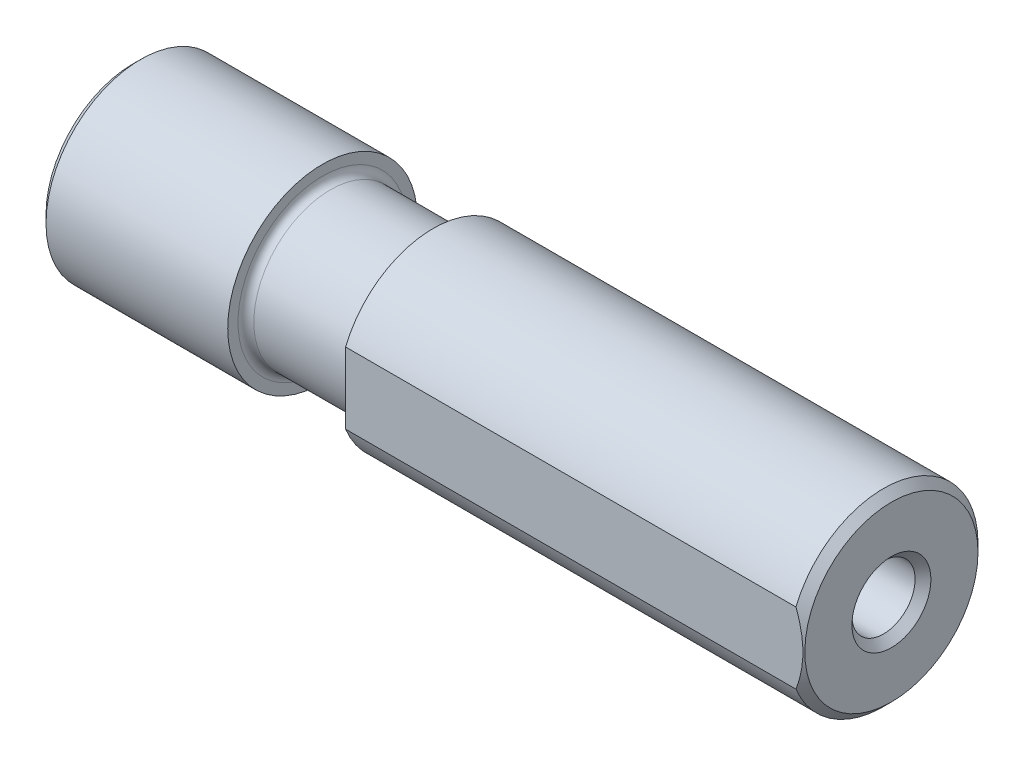
ISO-10303-21;
HEADER;
FILE_DESCRIPTION(('STEP AP214'),'2;1');
FILE_NAME('part.step','',(''),(''),'','','');
FILE_SCHEMA(('AUTOMOTIVE_DESIGN { 1 0 10303 214 1 1 1 1 }'));
ENDSEC;
DATA;
#1=APPLICATION_CONTEXT('core data for automotive mechanical design processes');
#2=APPLICATION_PROTOCOL_DEFINITION('international standard','automotive_design',2000,#1);
#3=PRODUCT_CONTEXT('',#1,'mechanical');
#4=PRODUCT('Part','Part','',(#3));
#5=PRODUCT_RELATED_PRODUCT_CATEGORY('part','',(#4));
#6=PRODUCT_DEFINITION_FORMATION('','',#4);
#7=PRODUCT_DEFINITION_CONTEXT('part definition',#1,'design');
#8=PRODUCT_DEFINITION('design','',#6,#7);
#9=PRODUCT_DEFINITION_SHAPE('','',#8);
#10=(LENGTH_UNIT() NAMED_UNIT(*) SI_UNIT(.MILLI.,.METRE.));
#11=(NAMED_UNIT(*) PLANE_ANGLE_UNIT() SI_UNIT($,.RADIAN.));
#12=(NAMED_UNIT(*) SI_UNIT($,.STERADIAN.) SOLID_ANGLE_UNIT());
#13=UNCERTAINTY_MEASURE_WITH_UNIT(LENGTH_MEASURE(1.E-05),#10,'distance_accuracy_value','');
#14=(GEOMETRIC_REPRESENTATION_CONTEXT(3) GLOBAL_UNCERTAINTY_ASSIGNED_CONTEXT((#13)) GLOBAL_UNIT_ASSIGNED_CONTEXT((#10,
#11,#12)) REPRESENTATION_CONTEXT('',''));
#15=CARTESIAN_POINT('',(0.,0.,0.));
#16=DIRECTION('',(0.,0.,1.));
#17=DIRECTION('',(1.,0.,0.));
#18=AXIS2_PLACEMENT_3D('',#15,#16,#17);
#19=CARTESIAN_POINT('',(0.,0.,0.));
#20=DIRECTION('',(-1.,0.,0.));
#21=DIRECTION('',(0.,0.,1.));
#22=AXIS2_PLACEMENT_3D('',#19,#20,#21);
#23=PLANE('',#22);
#24=CARTESIAN_POINT('',(0.,0.,0.));
#25=DIRECTION('',(-1.,0.,0.));
#26=DIRECTION('',(0.,0.,1.));
#27=AXIS2_PLACEMENT_3D('',#24,#25,#26);
#28=CIRCLE('',#27,1.25);
#29=CARTESIAN_POINT('',(0.,0.,1.25));
#30=VERTEX_POINT('',#29);
#31=EDGE_CURVE('E249',#30,#30,#28,.F.);
#32=ORIENTED_EDGE('',*,*,#31,.T.);
#33=EDGE_LOOP('',(#32));
#34=FACE_BOUND('',#33,.T.);
#35=CARTESIAN_POINT('',(0.,0.,0.));
#36=DIRECTION('',(-1.,0.,0.));
#37=DIRECTION('',(0.,0.,1.));
#38=AXIS2_PLACEMENT_3D('',#35,#36,#37);
#39=CIRCLE('',#38,2.75);
#40=CARTESIAN_POINT('',(0.,0.,2.75));
#41=VERTEX_POINT('',#40);
#42=EDGE_CURVE('E246',#41,#41,#39,.T.);
#43=ORIENTED_EDGE('',*,*,#42,.T.);
#44=EDGE_LOOP('',(#43));
#45=FACE_BOUND('',#44,.T.);
#46=ADVANCED_FACE('F17',(#34,#45),#23,.T.);
#47=CARTESIAN_POINT('',(24.,0.,0.));
#48=DIRECTION('',(1.,0.,0.));
#49=DIRECTION('',(0.,0.,-1.));
#50=AXIS2_PLACEMENT_3D('',#47,#48,#49);
#51=CYLINDRICAL_SURFACE('',#50,3.);
#52=CARTESIAN_POINT('',(0.250000000000004,0.,0.));
#53=DIRECTION('',(-1.,0.,0.));
#54=DIRECTION('',(0.,0.,1.));
#55=AXIS2_PLACEMENT_3D('',#52,#53,#54);
#56=CIRCLE('',#55,3.);
#57=CARTESIAN_POINT('',(0.250000000000004,0.,3.));
#58=VERTEX_POINT('',#57);
#59=EDGE_CURVE('E261',#58,#58,#56,.F.);
#60=ORIENTED_EDGE('',*,*,#59,.T.);
#61=EDGE_LOOP('',(#60));
#62=FACE_BOUND('',#61,.T.);
#63=CARTESIAN_POINT('',(6.,0.,0.));
#64=DIRECTION('',(1.,0.,0.));
#65=DIRECTION('',(0.,0.,-1.));
#66=AXIS2_PLACEMENT_3D('',#63,#64,#65);
#67=CIRCLE('',#66,3.);
#68=CARTESIAN_POINT('',(6.,0.,-3.));
#69=VERTEX_POINT('',#68);
#70=EDGE_CURVE('E244',#69,#69,#67,.T.);
#71=ORIENTED_EDGE('',*,*,#70,.F.);
#72=EDGE_LOOP('',(#71));
#73=FACE_BOUND('',#72,.T.);
#74=ADVANCED_FACE('F95',(#62,#73),#51,.T.);
#75=CARTESIAN_POINT('',(6.,3.,0.));
#76=DIRECTION('',(1.,0.,0.));
#77=DIRECTION('',(0.,0.,-1.));
#78=AXIS2_PLACEMENT_3D('',#75,#76,#77);
#79=PLANE('',#78);
#80=CARTESIAN_POINT('',(6.,0.,0.));
#81=DIRECTION('',(1.,0.,0.));
#82=DIRECTION('',(0.,0.,-1.));
#83=AXIS2_PLACEMENT_3D('',#80,#81,#82);
#84=CIRCLE('',#83,2.675);
#85=CARTESIAN_POINT('',(6.,0.,-2.675));
#86=VERTEX_POINT('',#85);
#87=EDGE_CURVE('E11',#86,#86,#84,.F.);
#88=ORIENTED_EDGE('',*,*,#87,.T.);
#89=EDGE_LOOP('',(#88));
#90=FACE_BOUND('',#89,.T.);
#91=ORIENTED_EDGE('',*,*,#70,.T.);
#92=EDGE_LOOP('',(#91));
#93=FACE_BOUND('',#92,.T.);
#94=ADVANCED_FACE('F92',(#90,#93),#79,.T.);
#95=CARTESIAN_POINT('',(24.,0.,0.));
#96=DIRECTION('',(1.,0.,0.));
#97=DIRECTION('',(0.,0.,-1.));
#98=AXIS2_PLACEMENT_3D('',#95,#96,#97);
#99=CYLINDRICAL_SURFACE('',#98,2.425);
#100=CARTESIAN_POINT('',(9.25,0.,0.));
#101=DIRECTION('',(-1.,0.,0.));
#102=DIRECTION('',(0.,0.,1.));
#103=AXIS2_PLACEMENT_3D('',#100,#101,#102);
#104=CIRCLE('',#103,2.425);
#105=CARTESIAN_POINT('',(9.25,0.,2.425));
#106=VERTEX_POINT('',#105);
#107=EDGE_CURVE('E25',#106,#106,#104,.T.);
#108=ORIENTED_EDGE('',*,*,#107,.T.);
#109=EDGE_LOOP('',(#108));
#110=FACE_BOUND('',#109,.T.);
#111=CARTESIAN_POINT('',(6.25,0.,0.));
#112=DIRECTION('',(1.,0.,0.));
#113=DIRECTION('',(0.,0.,-1.));
#114=AXIS2_PLACEMENT_3D('',#111,#112,#113);
#115=CIRCLE('',#114,2.425);
#116=CARTESIAN_POINT('',(6.25,0.,-2.425));
#117=VERTEX_POINT('',#116);
#118=EDGE_CURVE('E62',#117,#117,#115,.T.);
#119=ORIENTED_EDGE('',*,*,#118,.T.);
#120=EDGE_LOOP('',(#119));
#121=FACE_BOUND('',#120,.T.);
#122=ADVANCED_FACE('F73',(#110,#121),#99,.T.);
#123=CARTESIAN_POINT('',(9.5,2.425,0.));
#124=DIRECTION('',(-1.,0.,0.));
#125=DIRECTION('',(0.,0.,1.));
#126=AXIS2_PLACEMENT_3D('',#123,#124,#125);
#127=PLANE('',#126);
#128=DIRECTION('',(0.,1.,0.));
#129=VECTOR('',#128,1.);
#130=CARTESIAN_POINT('',(9.5,3.45940288963377,2.77));
#131=LINE('',#130,#129);
#132=CARTESIAN_POINT('',(9.5,-1.12569978235763,2.77));
#133=VERTEX_POINT('',#132);
#134=CARTESIAN_POINT('',(9.5,1.12569978235763,2.77));
#135=VERTEX_POINT('',#134);
#136=EDGE_CURVE('E37',#133,#135,#131,.T.);
#137=ORIENTED_EDGE('',*,*,#136,.T.);
#138=CARTESIAN_POINT('',(9.5,0.,0.));
#139=DIRECTION('',(1.,0.,0.));
#140=DIRECTION('',(0.,0.,-1.));
#141=AXIS2_PLACEMENT_3D('',#138,#139,#140);
#142=CIRCLE('',#141,2.99);
#143=EDGE_CURVE('E54',#133,#135,#142,.T.);
#144=ORIENTED_EDGE('',*,*,#143,.F.);
#145=EDGE_LOOP('',(#137,#144));
#146=FACE_BOUND('',#145,.T.);
#147=CARTESIAN_POINT('',(9.5,0.,0.));
#148=DIRECTION('',(-1.,0.,0.));
#149=DIRECTION('',(0.,0.,1.));
#150=AXIS2_PLACEMENT_3D('',#147,#148,#149);
#151=CIRCLE('',#150,2.675);
#152=CARTESIAN_POINT('',(9.5,0.,2.675));
#153=VERTEX_POINT('',#152);
#154=EDGE_CURVE('E58',#153,#153,#151,.F.);
#155=ORIENTED_EDGE('',*,*,#154,.T.);
#156=EDGE_LOOP('',(#155));
#157=FACE_BOUND('',#156,.T.);
#158=ADVANCED_FACE('F81',(#146,#157),#127,.T.);
#159=CARTESIAN_POINT('',(24.,0.,0.));
#160=DIRECTION('',(1.,0.,0.));
#161=DIRECTION('',(0.,0.,-1.));
#162=AXIS2_PLACEMENT_3D('',#159,#160,#161);
#163=CYLINDRICAL_SURFACE('',#162,2.99);
#164=DIRECTION('',(1.,0.,0.));
#165=VECTOR('',#164,1.);
#166=CARTESIAN_POINT('',(24.,1.12569978235763,2.77));
#167=LINE('',#166,#165);
#168=CARTESIAN_POINT('',(23.75,1.12569978235762,2.77));
#169=VERTEX_POINT('',#168);
#170=EDGE_CURVE('E44',#135,#169,#167,.T.);
#171=ORIENTED_EDGE('',*,*,#170,.T.);
#172=CARTESIAN_POINT('',(23.75,0.,0.));
#173=DIRECTION('',(1.,0.,0.));
#174=DIRECTION('',(0.,0.,-1.));
#175=AXIS2_PLACEMENT_3D('',#172,#173,#174);
#176=CIRCLE('',#175,2.99);
#177=CARTESIAN_POINT('',(23.75,-1.12569978235763,2.77));
#178=VERTEX_POINT('',#177);
#179=EDGE_CURVE('E52',#169,#178,#176,.F.);
#180=ORIENTED_EDGE('',*,*,#179,.T.);
#181=DIRECTION('',(1.,0.,0.));
#182=VECTOR('',#181,1.);
#183=CARTESIAN_POINT('',(24.,-1.12569978235763,2.77));
#184=LINE('',#183,#182);
#185=EDGE_CURVE('E32',#178,#133,#184,.F.);
#186=ORIENTED_EDGE('',*,*,#185,.T.);
#187=ORIENTED_EDGE('',*,*,#143,.T.);
#188=EDGE_LOOP('',(#171,#180,#186,#187));
#189=FACE_BOUND('',#188,.T.);
#190=ADVANCED_FACE('F51',(#189),#163,.T.);
#191=CARTESIAN_POINT('',(24.,2.99,0.));
#192=DIRECTION('',(1.,0.,0.));
#193=DIRECTION('',(0.,0.,-1.));
#194=AXIS2_PLACEMENT_3D('',#191,#192,#193);
#195=PLANE('',#194);
#196=CARTESIAN_POINT('',(24.,0.,0.));
#197=DIRECTION('',(1.,0.,0.));
#198=DIRECTION('',(0.,0.,-1.));
#199=AXIS2_PLACEMENT_3D('',#196,#197,#198);
#200=CIRCLE('',#199,1.25);
#201=CARTESIAN_POINT('',(24.,0.,-1.25));
#202=VERTEX_POINT('',#201);
#203=EDGE_CURVE('E59',#202,#202,#200,.F.);
#204=ORIENTED_EDGE('',*,*,#203,.T.);
#205=EDGE_LOOP('',(#204));
#206=FACE_BOUND('',#205,.T.);
#207=CARTESIAN_POINT('',(24.,0.,0.));
#208=DIRECTION('',(1.,0.,0.));
#209=DIRECTION('',(0.,0.,-1.));
#210=AXIS2_PLACEMENT_3D('',#207,#208,#209);
#211=CIRCLE('',#210,2.74);
#212=CARTESIAN_POINT('',(24.,0.,-2.74));
#213=VERTEX_POINT('',#212);
#214=EDGE_CURVE('E65',#213,#213,#211,.T.);
#215=ORIENTED_EDGE('',*,*,#214,.T.);
#216=EDGE_LOOP('',(#215));
#217=FACE_BOUND('',#216,.T.);
#218=ADVANCED_FACE('F90',(#206,#217),#195,.T.);
#219=CARTESIAN_POINT('',(0.,0.,0.));
#220=DIRECTION('',(1.,0.,0.));
#221=DIRECTION('',(0.,0.,-1.));
#222=AXIS2_PLACEMENT_3D('',#219,#220,#221);
#223=CYLINDRICAL_SURFACE('',#222,1.);
#224=CARTESIAN_POINT('',(0.25,0.,0.));
#225=DIRECTION('',(-1.,0.,0.));
#226=DIRECTION('',(0.,0.,1.));
#227=AXIS2_PLACEMENT_3D('',#224,#225,#226);
#228=CIRCLE('',#227,1.);
#229=CARTESIAN_POINT('',(0.25,0.,1.));
#230=VERTEX_POINT('',#229);
#231=EDGE_CURVE('E258',#230,#230,#228,.T.);
#232=ORIENTED_EDGE('',*,*,#231,.T.);
#233=EDGE_LOOP('',(#232));
#234=FACE_BOUND('',#233,.T.);
#235=CARTESIAN_POINT('',(23.75,0.,0.));
#236=DIRECTION('',(1.,0.,0.));
#237=DIRECTION('',(0.,0.,-1.));
#238=AXIS2_PLACEMENT_3D('',#235,#236,#237);
#239=CIRCLE('',#238,1.);
#240=CARTESIAN_POINT('',(23.75,0.,-1.));
#241=VERTEX_POINT('',#240);
#242=EDGE_CURVE('E255',#241,#241,#239,.T.);
#243=ORIENTED_EDGE('',*,*,#242,.T.);
#244=EDGE_LOOP('',(#243));
#245=FACE_BOUND('',#244,.T.);
#246=ADVANCED_FACE('F116',(#234,#245),#223,.F.);
#247=CARTESIAN_POINT('',(0.,0.,0.));
#248=DIRECTION('',(-1.,0.,0.));
#249=DIRECTION('',(0.,0.,1.));
#250=AXIS2_PLACEMENT_3D('',#247,#248,#249);
#251=CONICAL_SURFACE('',#250,1.25,0.785398163397448);
#252=ORIENTED_EDGE('',*,*,#231,.F.);
#253=EDGE_LOOP('',(#252));
#254=FACE_BOUND('',#253,.T.);
#255=ORIENTED_EDGE('',*,*,#31,.F.);
#256=EDGE_LOOP('',(#255));
#257=FACE_BOUND('',#256,.T.);
#258=ADVANCED_FACE('F108',(#254,#257),#251,.F.);
#259=CARTESIAN_POINT('',(0.250000000000004,0.,0.));
#260=DIRECTION('',(1.,0.,0.));
#261=DIRECTION('',(0.,0.,-1.));
#262=AXIS2_PLACEMENT_3D('',#259,#260,#261);
#263=CONICAL_SURFACE('',#262,3.,0.78539816339745);
#264=ORIENTED_EDGE('',*,*,#42,.F.);
#265=EDGE_LOOP('',(#264));
#266=FACE_BOUND('',#265,.T.);
#267=ORIENTED_EDGE('',*,*,#59,.F.);
#268=EDGE_LOOP('',(#267));
#269=FACE_BOUND('',#268,.T.);
#270=ADVANCED_FACE('F115',(#266,#269),#263,.T.);
#271=CARTESIAN_POINT('',(23.75,0.,0.));
#272=DIRECTION('',(1.,0.,0.));
#273=DIRECTION('',(0.,0.,-1.));
#274=AXIS2_PLACEMENT_3D('',#271,#272,#273);
#275=CONICAL_SURFACE('',#274,1.,0.78539816339745);
#276=ORIENTED_EDGE('',*,*,#203,.F.);
#277=EDGE_LOOP('',(#276));
#278=FACE_BOUND('',#277,.T.);
#279=ORIENTED_EDGE('',*,*,#242,.F.);
#280=EDGE_LOOP('',(#279));
#281=FACE_BOUND('',#280,.T.);
#282=ADVANCED_FACE('F123',(#278,#281),#275,.F.);
#283=CARTESIAN_POINT('',(24.,0.,0.));
#284=DIRECTION('',(-1.,0.,0.));
#285=DIRECTION('',(0.,0.,1.));
#286=AXIS2_PLACEMENT_3D('',#283,#284,#285);
#287=CONICAL_SURFACE('',#286,2.74,0.785398163397448);
#288=CARTESIAN_POINT('',(17.764576528817,8.5372903480591,2.77));
#289=CARTESIAN_POINT('',(17.9048423774126,8.38982279413043,2.77));
#290=CARTESIAN_POINT('',(18.0449300391954,8.24218561423592,2.77));
#291=CARTESIAN_POINT('',(18.3246811093057,7.94650817648765,2.77));
#292=CARTESIAN_POINT('',(18.464344514996,7.79846791613926,2.77));
#293=CARTESIAN_POINT('',(18.8827116745884,7.35352428546614,2.77));
#294=CARTESIAN_POINT('',(19.1606737813262,7.0559225152558,2.77));
#295=CARTESIAN_POINT('',(19.7171983228802,6.4544639822048,2.77));
#296=CARTESIAN_POINT('',(19.9957263400019,6.15057526461015,2.77));
#297=CARTESIAN_POINT('',(20.4102363084596,5.6918583543068,2.77));
#298=CARTESIAN_POINT('',(20.5478385042845,5.53849574291661,2.77));
#299=CARTESIAN_POINT('',(20.8216699488644,5.2305527529665,2.77));
#300=CARTESIAN_POINT('',(20.9578992082289,5.0759723838335,2.77));
#301=CARTESIAN_POINT('',(21.3016993141576,4.68146609576847,2.77));
#302=CARTESIAN_POINT('',(21.5080925456076,4.44050511918899,2.77));
#303=CARTESIAN_POINT('',(21.8130863908197,4.07504906950316,2.77));
#304=CARTESIAN_POINT('',(21.914027234003,3.95250796673908,2.77));
#305=CARTESIAN_POINT('',(22.1139131489713,3.70580979912626,2.77));
#306=CARTESIAN_POINT('',(22.2128582772866,3.58165278021408,2.77));
#307=CARTESIAN_POINT('',(22.4079774597422,3.33160921837402,2.77));
#308=CARTESIAN_POINT('',(22.5041570872622,3.20572703843905,2.77));
#309=CARTESIAN_POINT('',(22.693187216828,2.95144645110269,2.77));
#310=CARTESIAN_POINT('',(22.7860372387731,2.82304768492615,2.77));
#311=CARTESIAN_POINT('',(22.9671171892356,2.56328153721349,2.77));
#312=CARTESIAN_POINT('',(23.0553533936085,2.43191855554756,2.77));
#313=CARTESIAN_POINT('',(23.2256439160106,2.16525881078545,2.77));
#314=CARTESIAN_POINT('',(23.3077004347633,2.029963472106,2.77));
#315=CARTESIAN_POINT('',(23.4430410393034,1.79001020101257,2.77));
#316=CARTESIAN_POINT('',(23.4982830234326,1.68646336682811,2.77));
#317=CARTESIAN_POINT('',(23.6025268125139,1.47620436093873,2.77));
#318=CARTESIAN_POINT('',(23.651527115105,1.36949143475335,2.77));
#319=CARTESIAN_POINT('',(23.7411481130313,1.15319030709812,2.77));
#320=CARTESIAN_POINT('',(23.7818100925112,1.04361945598801,2.77));
#321=CARTESIAN_POINT('',(23.8527564505579,0.821184117433054,2.77));
#322=CARTESIAN_POINT('',(23.8830499459437,0.708322618659198,2.77));
#323=CARTESIAN_POINT('',(23.9241026783283,0.512583213206293,2.77));
#324=CARTESIAN_POINT('',(23.9379705317478,0.430357010480408,2.77));
#325=CARTESIAN_POINT('',(23.9585593997502,0.26501196302226,2.77));
#326=CARTESIAN_POINT('',(23.9652817755554,0.181893291355009,2.77));
#327=CARTESIAN_POINT('',(23.9712036659773,0.015473577781737,2.77));
#328=CARTESIAN_POINT('',(23.9704112393818,-0.0678271730084054,2.77));
#329=CARTESIAN_POINT('',(23.9613714741798,-0.234025538375774,2.77));
#330=CARTESIAN_POINT('',(23.9531230129271,-0.316923090354021,2.77));
#331=CARTESIAN_POINT('',(23.9268598674314,-0.50097188338168,2.77));
#332=CARTESIAN_POINT('',(23.9070133596741,-0.601861668876813,2.77));
#333=CARTESIAN_POINT('',(23.8580353416469,-0.801373300254173,2.77));
#334=CARTESIAN_POINT('',(23.8288980111403,-0.899993682835503,2.77));
#335=CARTESIAN_POINT('',(23.762797688243,-1.09513234595655,2.77));
#336=CARTESIAN_POINT('',(23.7257932546571,-1.19163638576721,2.77));
#337=CARTESIAN_POINT('',(23.6455974035726,-1.38198132191513,2.77));
#338=CARTESIAN_POINT('',(23.602407125151,-1.47582270475743,2.77));
#339=CARTESIAN_POINT('',(23.4833499362874,-1.7174817074,2.77));
#340=CARTESIAN_POINT('',(23.4035983756312,-1.86337605685073,2.77));
#341=CARTESIAN_POINT('',(23.2353859801521,-2.15008816324019,2.77));
#342=CARTESIAN_POINT('',(23.1469186913962,-2.29090205111037,2.77));
#343=CARTESIAN_POINT('',(22.963642719388,-2.56883303680629,2.77));
#344=CARTESIAN_POINT('',(22.8688182224558,-2.70593962820393,2.77));
#345=CARTESIAN_POINT('',(22.6747761932785,-2.97692352410337,2.77));
#346=CARTESIAN_POINT('',(22.5755599528576,-3.11080176055531,2.77));
#347=CARTESIAN_POINT('',(22.3730744772916,-3.37707915711643,2.77));
#348=CARTESIAN_POINT('',(22.2697798956143,-3.50945896122559,2.77));
#349=CARTESIAN_POINT('',(22.0606646889163,-3.77221421878945,2.77));
#350=CARTESIAN_POINT('',(21.9548439127792,-3.90258955156637,2.77));
#351=CARTESIAN_POINT('',(21.7414167269421,-4.16152576847423,2.77));
#352=CARTESIAN_POINT('',(21.6338133553397,-4.29008916252522,2.77));
#353=CARTESIAN_POINT('',(21.4170673539056,-4.54591271507352,2.77));
#354=CARTESIAN_POINT('',(21.3079247007257,-4.67317285375206,2.77));
#355=CARTESIAN_POINT('',(21.0580823791636,-4.96163645358708,2.77));
#356=CARTESIAN_POINT('',(20.9169950917822,-5.12250389691459,2.77));
#357=CARTESIAN_POINT('',(20.6332684943254,-5.44286457297836,2.77));
#358=CARTESIAN_POINT('',(20.4906291667645,-5.60235779019597,2.77));
#359=CARTESIAN_POINT('',(20.0607397544441,-6.07937125010543,2.77));
#360=CARTESIAN_POINT('',(19.7716704492829,-6.39525113980373,2.77));
#361=CARTESIAN_POINT('',(19.1972805827742,-7.0166449373149,2.77));
#362=CARTESIAN_POINT('',(18.9120335481325,-7.32222709019587,2.77));
#363=CARTESIAN_POINT('',(18.4826833254505,-7.77901391438223,2.77));
#364=CARTESIAN_POINT('',(18.3393686380809,-7.93096072397623,2.77));
#365=CARTESIAN_POINT('',(18.0522905841471,-8.23442793629657,2.77));
#366=CARTESIAN_POINT('',(17.9085272207552,-8.38594834202338,2.77));
#367=CARTESIAN_POINT('',(17.764576528817,-8.5372903480591,2.77));
#368=B_SPLINE_CURVE_WITH_KNOTS('',3,(#288,#289,#290,#291,#292,#293,#294,#295,#296,#297,#298,
#299,#300,#301,#302,#303,#304,#305,#306,#307,#308,#309,#310,#311,#312,#313,#314,#315,#316,#317,
#318,#319,#320,#321,#322,#323,#324,#325,#326,#327,#328,#329,#330,#331,#332,#333,#334,#335,#336,
#337,#338,#339,#340,#341,#342,#343,#344,#345,#346,#347,#348,#349,#350,#351,#352,#353,#354,#355,
#356,#357,#358,#359,#360,#361,#362,#363,#364,#365,#366,#367),.UNSPECIFIED.,.F.,.F.,(4,2,2,2,2,2,
2,2,2,2,2,2,2,2,2,2,2,2,2,2,2,2,2,2,2,2,2,2,2,2,2,2,2,2,2,2,2,2,2,4),(0.,0.610565788513842,
1.22113536438368,2.44279022104408,3.67942215340052,4.29754916605229,4.91567139834375,
5.86739700579523,6.34366777839784,6.81992504122263,7.29514352073709,7.77043024942093,
8.24505269825037,8.71950531626419,9.07143117534946,9.42344158291069,9.77366465914947,
10.1235789947237,10.373464486681,10.6233023666085,10.8728723535834,11.1224799242677,
11.4304187827962,11.7385509299025,12.0483483142962,12.3580887249899,12.8564138605024,
13.3551108160302,13.8550979485422,14.354938975482,14.8586329374052,15.3623571060497,
15.8652966593496,16.3682438495918,17.0101457228064,17.6520548353144,18.9365668755432,
20.1906353872663,20.8172464124427,21.4438530172847),.UNSPECIFIED.);
#369=EDGE_CURVE('E41',#169,#178,#368,.T.);
#370=ORIENTED_EDGE('',*,*,#369,.T.);
#371=ORIENTED_EDGE('',*,*,#179,.F.);
#372=EDGE_LOOP('',(#370,#371));
#373=FACE_BOUND('',#372,.T.);
#374=ORIENTED_EDGE('',*,*,#214,.F.);
#375=EDGE_LOOP('',(#374));
#376=FACE_BOUND('',#375,.T.);
#377=ADVANCED_FACE('F56',(#373,#376),#287,.T.);
#378=CARTESIAN_POINT('',(9.25,0.,0.));
#379=DIRECTION('',(-1.,0.,0.));
#380=DIRECTION('',(0.,0.,1.));
#381=AXIS2_PLACEMENT_3D('',#378,#379,#380);
#382=TOROIDAL_SURFACE('',#381,2.675,0.25);
#383=ORIENTED_EDGE('',*,*,#107,.F.);
#384=EDGE_LOOP('',(#383));
#385=FACE_BOUND('',#384,.T.);
#386=ORIENTED_EDGE('',*,*,#154,.F.);
#387=EDGE_LOOP('',(#386));
#388=FACE_BOUND('',#387,.T.);
#389=ADVANCED_FACE('F76',(#385,#388),#382,.F.);
#390=CARTESIAN_POINT('',(6.25,0.,0.));
#391=DIRECTION('',(1.,0.,0.));
#392=DIRECTION('',(0.,0.,-1.));
#393=AXIS2_PLACEMENT_3D('',#390,#391,#392);
#394=TOROIDAL_SURFACE('',#393,2.675,0.25);
#395=ORIENTED_EDGE('',*,*,#87,.F.);
#396=EDGE_LOOP('',(#395));
#397=FACE_BOUND('',#396,.T.);
#398=ORIENTED_EDGE('',*,*,#118,.F.);
#399=EDGE_LOOP('',(#398));
#400=FACE_BOUND('',#399,.T.);
#401=ADVANCED_FACE('F19',(#397,#400),#394,.F.);
#402=CARTESIAN_POINT('',(-0.001000000000001,3.45940288963377,2.77));
#403=DIRECTION('',(0.,0.,-1.));
#404=DIRECTION('',(0.,1.,0.));
#405=AXIS2_PLACEMENT_3D('',#402,#403,#404);
#406=PLANE('',#405);
#407=ORIENTED_EDGE('',*,*,#185,.F.);
#408=ORIENTED_EDGE('',*,*,#369,.F.);
#409=ORIENTED_EDGE('',*,*,#170,.F.);
#410=ORIENTED_EDGE('',*,*,#136,.F.);
#411=EDGE_LOOP('',(#407,#408,#409,#410));
#412=FACE_BOUND('',#411,.T.);
#413=ADVANCED_FACE('F43',(#412),#406,.F.);
#414=CLOSED_SHELL('',(#46,#74,#94,#122,#158,#190,#218,#246,#258,#270,#282,#377,#389,#401,#413));
#415=MANIFOLD_SOLID_BREP('B1',#414);
#416=ADVANCED_BREP_SHAPE_REPRESENTATION('',(#18,#415),#14);
#417=SHAPE_DEFINITION_REPRESENTATION(#9,#416);
ENDSEC;
END-ISO-10303-21;
